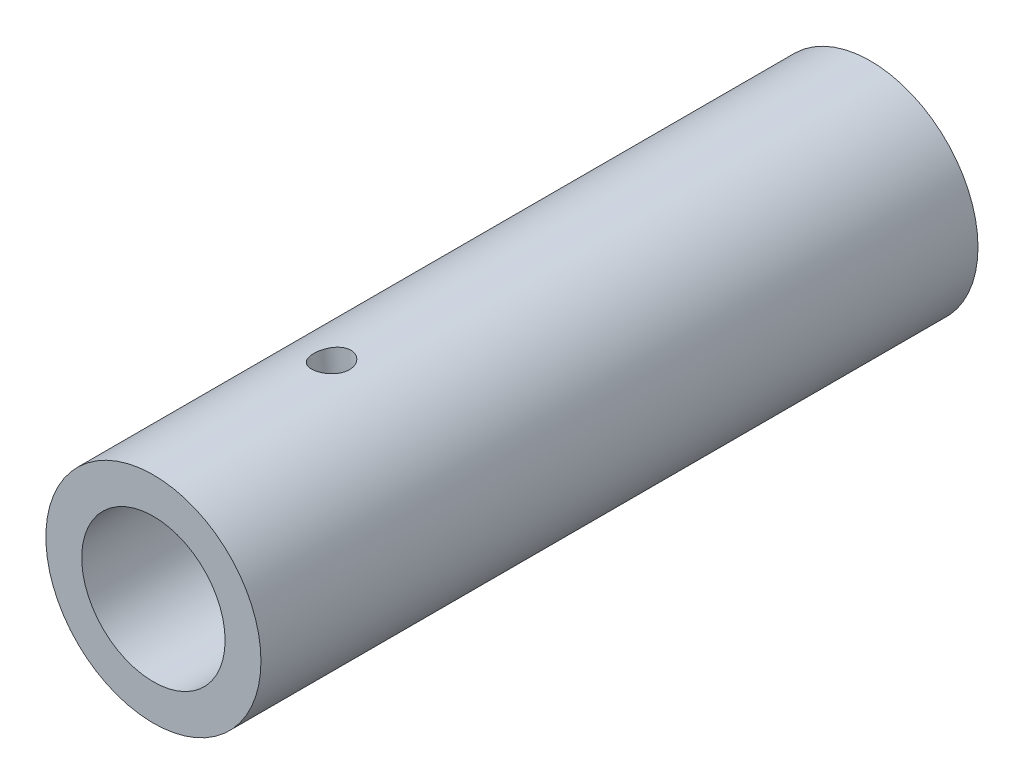
ISO-10303-21;
HEADER;
FILE_DESCRIPTION(('STEP AP214'),'2;1');
FILE_NAME('part.step','',(''),(''),'','','');
FILE_SCHEMA(('AUTOMOTIVE_DESIGN { 1 0 10303 214 1 1 1 1 }'));
ENDSEC;
DATA;
#1=APPLICATION_CONTEXT('core data for automotive mechanical design processes');
#2=APPLICATION_PROTOCOL_DEFINITION('international standard','automotive_design',2000,#1);
#3=PRODUCT_CONTEXT('',#1,'mechanical');
#4=PRODUCT('Part','Part','',(#3));
#5=PRODUCT_RELATED_PRODUCT_CATEGORY('part','',(#4));
#6=PRODUCT_DEFINITION_FORMATION('','',#4);
#7=PRODUCT_DEFINITION_CONTEXT('part definition',#1,'design');
#8=PRODUCT_DEFINITION('design','',#6,#7);
#9=PRODUCT_DEFINITION_SHAPE('','',#8);
#10=(LENGTH_UNIT() NAMED_UNIT(*) SI_UNIT(.MILLI.,.METRE.));
#11=(NAMED_UNIT(*) PLANE_ANGLE_UNIT() SI_UNIT($,.RADIAN.));
#12=(NAMED_UNIT(*) SI_UNIT($,.STERADIAN.) SOLID_ANGLE_UNIT());
#13=UNCERTAINTY_MEASURE_WITH_UNIT(LENGTH_MEASURE(1.E-05),#10,'distance_accuracy_value','');
#14=(GEOMETRIC_REPRESENTATION_CONTEXT(3) GLOBAL_UNCERTAINTY_ASSIGNED_CONTEXT((#13)) GLOBAL_UNIT_ASSIGNED_CONTEXT((#10,
#11,#12)) REPRESENTATION_CONTEXT('',''));
#15=CARTESIAN_POINT('',(0.,0.,0.));
#16=DIRECTION('',(0.,0.,1.));
#17=DIRECTION('',(1.,0.,0.));
#18=AXIS2_PLACEMENT_3D('',#15,#16,#17);
#19=CARTESIAN_POINT('',(0.,0.,63.5));
#20=DIRECTION('',(0.,0.,-1.));
#21=DIRECTION('',(-1.,0.,0.));
#22=AXIS2_PLACEMENT_3D('',#19,#20,#21);
#23=CYLINDRICAL_SURFACE('',#22,9.525);
#24=CARTESIAN_POINT('',(-2.55989168892291,9.17456154489049,46.736));
#25=CARTESIAN_POINT('',(-2.55988831826612,9.17456350531099,46.647496399918));
#26=CARTESIAN_POINT('',(-2.5526382001706,9.17659495945552,46.5589444701448));
#27=CARTESIAN_POINT('',(-2.52383087530217,9.18455864563898,46.3843252250277));
#28=CARTESIAN_POINT('',(-2.50226047444081,9.19049447495359,46.2982602774636));
#29=CARTESIAN_POINT('',(-2.4454507172223,9.20577291746254,46.1311674000781));
#30=CARTESIAN_POINT('',(-2.41022278459267,9.21511268307277,46.0501353260995));
#31=CARTESIAN_POINT('',(-2.32707723750839,9.23645875416685,45.8952720937542));
#32=CARTESIAN_POINT('',(-2.27916105107415,9.24846475954985,45.8214401263184));
#33=CARTESIAN_POINT('',(-2.17143462089355,9.27435085387942,45.6823363404122));
#34=CARTESIAN_POINT('',(-2.11152317045665,9.28824654257293,45.6171457915698));
#35=CARTESIAN_POINT('',(-1.98165553828989,9.31681696341755,45.4978812501428));
#36=CARTESIAN_POINT('',(-1.91169876163923,9.33149174167671,45.4438079164217));
#37=CARTESIAN_POINT('',(-1.76314392658459,9.36069997875275,45.3480077498158));
#38=CARTESIAN_POINT('',(-1.68449677465692,9.37523207093537,45.3063565500903));
#39=CARTESIAN_POINT('',(-1.52106101932333,9.40313045704525,45.2370691202131));
#40=CARTESIAN_POINT('',(-1.43627281565095,9.41649682672716,45.2094319787931));
#41=CARTESIAN_POINT('',(-1.26375408459807,9.44119007950734,45.1692057402852));
#42=CARTESIAN_POINT('',(-1.17605794004749,9.45253464907446,45.156480098337));
#43=CARTESIAN_POINT('',(-0.999505048796109,9.47282996252522,45.1460134961131));
#44=CARTESIAN_POINT('',(-0.910648381392007,9.48178086907586,45.148271517318));
#45=CARTESIAN_POINT('',(-0.735230344673378,9.49698579016896,45.1676016582204));
#46=CARTESIAN_POINT('',(-0.648654958289234,9.50326563824046,45.1845268287648));
#47=CARTESIAN_POINT('',(-0.479351267696876,9.51330876293258,45.2324794321465));
#48=CARTESIAN_POINT('',(-0.396623080741902,9.51707196289863,45.2635072944893));
#49=CARTESIAN_POINT('',(-0.236966179823889,9.52238876595142,45.3389305566002));
#50=CARTESIAN_POINT('',(-0.160065752179453,9.52393217377622,45.3833865076724));
#51=CARTESIAN_POINT('',(-0.0146199080776866,9.525266888753,45.4843596423733));
#52=CARTESIAN_POINT('',(0.0539248314585257,9.52505805404577,45.5408778021814));
#53=CARTESIAN_POINT('',(0.181524293810001,9.52348689043198,45.6651860422033));
#54=CARTESIAN_POINT('',(0.240453794329464,9.52211059800672,45.7331045552621));
#55=CARTESIAN_POINT('',(0.346092659652763,9.51885742525867,45.8778528022871));
#56=CARTESIAN_POINT('',(0.392801911734198,9.51698054031861,45.9546826184436));
#57=CARTESIAN_POINT('',(0.472639281531789,9.51335081678229,46.1152186925922));
#58=CARTESIAN_POINT('',(0.505752128836804,9.51159811948119,46.1989325562885));
#59=CARTESIAN_POINT('',(0.557269839074049,9.50871955166309,46.3707791609153));
#60=CARTESIAN_POINT('',(0.575675997053133,9.50759362595628,46.4589115120346));
#61=CARTESIAN_POINT('',(0.597050587726222,9.50627532108073,46.635966009163));
#62=CARTESIAN_POINT('',(0.600200771748791,9.50607195292405,46.7248661511108));
#63=CARTESIAN_POINT('',(0.591453617683163,9.50662011939308,46.9019170365237));
#64=CARTESIAN_POINT('',(0.579556860797966,9.50737161713614,46.9900678088014));
#65=CARTESIAN_POINT('',(0.54122623612501,9.50962986394587,47.1625471270862));
#66=CARTESIAN_POINT('',(0.514884800587795,9.51113180551065,47.2468963238225));
#67=CARTESIAN_POINT('',(0.44854656252462,9.5144903923999,47.4100335555875));
#68=CARTESIAN_POINT('',(0.408548943104592,9.51634705894061,47.4888212575948));
#69=CARTESIAN_POINT('',(0.315657924266237,9.51988220125152,47.6393983674479));
#70=CARTESIAN_POINT('',(0.26264898315702,9.52155887552392,47.7111165237001));
#71=CARTESIAN_POINT('',(0.145463741301043,9.52406907439896,47.8447820932613));
#72=CARTESIAN_POINT('',(0.0812866550913914,9.52490253967006,47.9067288187547));
#73=CARTESIAN_POINT('',(-0.0571480730046795,9.5250821755016,48.0197489518827));
#74=CARTESIAN_POINT('',(-0.131503609236493,9.52441278840041,48.0707025796907));
#75=CARTESIAN_POINT('',(-0.287649892620324,9.52097537632037,48.1594511326481));
#76=CARTESIAN_POINT('',(-0.369440399158309,9.51820741923516,48.1972464834409));
#77=CARTESIAN_POINT('',(-0.537727623201132,9.51018048859539,48.2584192208113));
#78=CARTESIAN_POINT('',(-0.624202060168446,9.50493252434683,48.2818592880917));
#79=CARTESIAN_POINT('',(-0.799663983000664,9.49178049376597,48.313857905342));
#80=CARTESIAN_POINT('',(-0.888651261474124,9.48387664604729,48.322417679795));
#81=CARTESIAN_POINT('',(-1.06545013855092,9.46563492669853,48.3243774952682));
#82=CARTESIAN_POINT('',(-1.15326292964579,9.45532767632539,48.3179597862526));
#83=CARTESIAN_POINT('',(-1.32629905109098,9.43261218973686,48.2905410093589));
#84=CARTESIAN_POINT('',(-1.41152239593837,9.42020396528637,48.2695400231414));
#85=CARTESIAN_POINT('',(-1.57692125298234,9.39393179886248,48.2136207648797));
#86=CARTESIAN_POINT('',(-1.65710227067637,9.38006949028499,48.1787179881864));
#87=CARTESIAN_POINT('',(-1.81037746945977,9.35169722444922,48.0960062104938));
#88=CARTESIAN_POINT('',(-1.88347131438051,9.33718723651694,48.0481965976863));
#89=CARTESIAN_POINT('',(-2.02145862745322,9.30829540594342,47.9403822162866));
#90=CARTESIAN_POINT('',(-2.08624854075988,9.29391693648733,47.8802439937294));
#91=CARTESIAN_POINT('',(-2.20494327555553,9.26647564558147,47.7497595244847));
#92=CARTESIAN_POINT('',(-2.25884554391002,9.25341313308052,47.6794108901039));
#93=CARTESIAN_POINT('',(-2.354649544386,9.22950231060974,47.5299117202076));
#94=CARTESIAN_POINT('',(-2.39646369359372,9.21867031640528,47.4507024442027));
#95=CARTESIAN_POINT('',(-2.46637448626326,9.20021414699752,47.2861581351963));
#96=CARTESIAN_POINT('',(-2.49448483346111,9.19258676825342,47.2008293200878));
#97=CARTESIAN_POINT('',(-2.53012874624201,9.18282631080359,47.051973606382));
#98=CARTESIAN_POINT('',(-2.54127273363322,9.17973953675243,46.9893479769455));
#99=CARTESIAN_POINT('',(-2.55615534868146,9.17560646802606,46.8631565371268));
#100=CARTESIAN_POINT('',(-2.55989411077437,9.17456013630827,46.7995907438336));
#101=CARTESIAN_POINT('',(-2.55989168892291,9.17456154489049,46.736));
#102=B_SPLINE_CURVE_WITH_KNOTS('',3,(#24,#25,#26,#27,#28,#29,#30,#31,#32,#33,#34,#35,#36,#37,
#38,#39,#40,#41,#42,#43,#44,#45,#46,#47,#48,#49,#50,#51,#52,#53,#54,#55,#56,#57,#58,#59,#60,#61,
#62,#63,#64,#65,#66,#67,#68,#69,#70,#71,#72,#73,#74,#75,#76,#77,#78,#79,#80,#81,#82,#83,#84,#85,
#86,#87,#88,#89,#90,#91,#92,#93,#94,#95,#96,#97,#98,#99,#100,#101),.UNSPECIFIED.,.T.,.F.,(4,2,2,
2,2,2,2,2,2,2,2,2,2,2,2,2,2,2,2,2,2,2,2,2,2,2,2,2,2,2,2,2,2,2,2,2,2,2,4),(0.,0.265278259719115,
0.530801275176486,0.796102673650747,1.06137422602349,1.32898616063879,1.59661395074875,
1.86583942370762,2.13504738795557,2.40177045345079,2.66847538854459,2.93253871939565,
3.19661009298453,3.46189048628536,3.72719235653995,3.99571288398449,4.26423588823722,
4.53305965686614,4.8018597507068,5.06744949436961,5.33302897967875,5.59692851043536,
5.86084383006419,6.12719337654315,6.39356166313488,6.66270011777467,6.93182986552703,
7.19977595105205,7.46769998654342,7.73238087928857,7.99706028993953,8.2614455029361,
8.52584325049132,8.79327043389165,9.0607602558995,9.33014217036923,9.59925414881156,
9.78986275793719,9.98046790668582),.UNSPECIFIED.);
#103=CARTESIAN_POINT('',(-2.55989168892291,9.17456154489049,46.736));
#104=VERTEX_POINT('',#103);
#105=EDGE_CURVE('E76',#104,#104,#102,.T.);
#106=ORIENTED_EDGE('',*,*,#105,.T.);
#107=EDGE_LOOP('',(#106));
#108=FACE_BOUND('',#107,.T.);
#109=CARTESIAN_POINT('',(0.,0.,63.5));
#110=DIRECTION('',(0.,0.,1.));
#111=DIRECTION('',(1.,0.,0.));
#112=AXIS2_PLACEMENT_3D('',#109,#110,#111);
#113=CIRCLE('',#112,9.525);
#114=CARTESIAN_POINT('',(9.525,0.,63.5));
#115=VERTEX_POINT('',#114);
#116=EDGE_CURVE('E64',#115,#115,#113,.T.);
#117=ORIENTED_EDGE('',*,*,#116,.F.);
#118=EDGE_LOOP('',(#117));
#119=FACE_BOUND('',#118,.T.);
#120=CARTESIAN_POINT('',(0.,0.,0.));
#121=DIRECTION('',(0.,0.,1.));
#122=DIRECTION('',(1.,0.,0.));
#123=AXIS2_PLACEMENT_3D('',#120,#121,#122);
#124=CIRCLE('',#123,9.525);
#125=CARTESIAN_POINT('',(9.525,0.,0.));
#126=VERTEX_POINT('',#125);
#127=EDGE_CURVE('E95',#126,#126,#124,.T.);
#128=ORIENTED_EDGE('',*,*,#127,.T.);
#129=EDGE_LOOP('',(#128));
#130=FACE_BOUND('',#129,.T.);
#131=ADVANCED_FACE('F42',(#108,#119,#130),#23,.T.);
#132=CARTESIAN_POINT('',(0.,0.,63.5));
#133=DIRECTION('',(0.,0.,1.));
#134=DIRECTION('',(1.,0.,0.));
#135=AXIS2_PLACEMENT_3D('',#132,#133,#134);
#136=PLANE('',#135);
#137=CARTESIAN_POINT('',(0.,0.,63.5));
#138=DIRECTION('',(0.,0.,1.));
#139=DIRECTION('',(1.,0.,0.));
#140=AXIS2_PLACEMENT_3D('',#137,#138,#139);
#141=CIRCLE('',#140,6.35);
#142=CARTESIAN_POINT('',(6.35,0.,63.5));
#143=VERTEX_POINT('',#142);
#144=EDGE_CURVE('E89',#143,#143,#141,.T.);
#145=ORIENTED_EDGE('',*,*,#144,.F.);
#146=EDGE_LOOP('',(#145));
#147=FACE_BOUND('',#146,.T.);
#148=ORIENTED_EDGE('',*,*,#116,.T.);
#149=EDGE_LOOP('',(#148));
#150=FACE_BOUND('',#149,.T.);
#151=ADVANCED_FACE('F112',(#147,#150),#136,.T.);
#152=CARTESIAN_POINT('',(0.,0.,0.));
#153=DIRECTION('',(0.,0.,1.));
#154=DIRECTION('',(1.,0.,0.));
#155=AXIS2_PLACEMENT_3D('',#152,#153,#154);
#156=PLANE('',#155);
#157=CARTESIAN_POINT('',(0.,0.,0.));
#158=DIRECTION('',(0.,0.,-1.));
#159=DIRECTION('',(-1.,0.,0.));
#160=AXIS2_PLACEMENT_3D('',#157,#158,#159);
#161=CIRCLE('',#160,6.3239396);
#162=CARTESIAN_POINT('',(-6.3239396,0.,0.));
#163=VERTEX_POINT('',#162);
#164=EDGE_CURVE('E225',#163,#163,#161,.T.);
#165=ORIENTED_EDGE('',*,*,#164,.F.);
#166=EDGE_LOOP('',(#165));
#167=FACE_BOUND('',#166,.T.);
#168=ORIENTED_EDGE('',*,*,#127,.F.);
#169=EDGE_LOOP('',(#168));
#170=FACE_BOUND('',#169,.T.);
#171=ADVANCED_FACE('F81',(#167,#170),#156,.F.);
#172=CARTESIAN_POINT('',(0.,0.,15.24));
#173=DIRECTION('',(0.,0.,1.));
#174=DIRECTION('',(1.,0.,0.));
#175=AXIS2_PLACEMENT_3D('',#172,#173,#174);
#176=CYLINDRICAL_SURFACE('',#175,6.35);
#177=CARTESIAN_POINT('',(-1.5352552919074,6.16161433300319,45.5424698259082));
#178=CARTESIAN_POINT('',(-1.59537678810267,6.14663470540504,45.6057186618809));
#179=CARTESIAN_POINT('',(-1.64982823468634,6.1321359909974,45.6745044845966));
#180=CARTESIAN_POINT('',(-1.74685628927597,6.10520580641474,45.8203721208462));
#181=CARTESIAN_POINT('',(-1.7894186742125,6.09277681940119,45.8974637192971));
#182=CARTESIAN_POINT('',(-1.86279924056462,6.07074670572261,46.0585066748159));
#183=CARTESIAN_POINT('',(-1.89347531356184,6.06118009102036,46.1425272907608));
#184=CARTESIAN_POINT('',(-1.94218465890743,6.04574819735847,46.3144394818225));
#185=CARTESIAN_POINT('',(-1.96022007418172,6.03988229104771,46.4023303981347));
#186=CARTESIAN_POINT('',(-1.98468147847544,6.03189285044413,46.588680943611));
#187=CARTESIAN_POINT('',(-1.98979838696114,6.03019180543395,46.6873330167476));
#188=CARTESIAN_POINT('',(-1.98460579258066,6.03190218549738,46.8842105667289));
#189=CARTESIAN_POINT('',(-1.97429089242113,6.03531539928972,46.9824358822628));
#190=CARTESIAN_POINT('',(-1.93792827663573,6.04709087519716,47.1778507580266));
#191=CARTESIAN_POINT('',(-1.91154555796614,6.05555844012512,47.2749721225143));
#192=CARTESIAN_POINT('',(-1.84294538607433,6.07678666545319,47.4630527332371));
#193=CARTESIAN_POINT('',(-1.80072004354115,6.08954946446755,47.5540088826297));
#194=CARTESIAN_POINT('',(-1.70224349645687,6.11779459266944,47.7238952281841));
#195=CARTESIAN_POINT('',(-1.6464464618536,6.13318481914204,47.8031025059197));
#196=CARTESIAN_POINT('',(-1.52078518910066,6.16554047225022,47.949026897868));
#197=CARTESIAN_POINT('',(-1.45094993983432,6.18250261460193,48.015769213097));
#198=CARTESIAN_POINT('',(-1.32042134643235,6.21144770068859,48.1158448844627));
#199=CARTESIAN_POINT('',(-1.26285571581384,6.22346264568183,48.1532692438344));
#200=CARTESIAN_POINT('',(-1.14214497939012,6.24674070775008,48.218014665701));
#201=CARTESIAN_POINT('',(-1.07900448987476,6.25800443355649,48.2453439920061));
#202=CARTESIAN_POINT('',(-0.94823272921376,6.2791527126661,48.2884721131978));
#203=CARTESIAN_POINT('',(-0.880578027823099,6.28902908497854,48.3042046594862));
#204=CARTESIAN_POINT('',(-0.743255666710866,6.30673068347335,48.3227760535236));
#205=CARTESIAN_POINT('',(-0.673588850286035,6.31455675549455,48.3256202262092));
#206=CARTESIAN_POINT('',(-0.541417241115669,6.3271916341513,48.3185801826672));
#207=CARTESIAN_POINT('',(-0.478865729857623,6.33221767641478,48.3098892952861));
#208=CARTESIAN_POINT('',(-0.355926396674106,6.3403164863451,48.2823477412909));
#209=CARTESIAN_POINT('',(-0.295538683395975,6.34338915605967,48.2634965652747));
#210=CARTESIAN_POINT('',(-0.177705471363907,6.3477904816165,48.2163598337415));
#211=CARTESIAN_POINT('',(-0.120303045842187,6.34909815242251,48.1879656870823));
#212=CARTESIAN_POINT('',(-0.0102843926260279,6.35023044893899,48.1230745053097));
#213=CARTESIAN_POINT('',(0.042330129226494,6.35005454815505,48.0865745980737));
#214=CARTESIAN_POINT('',(0.148349198486213,6.3485155118516,48.0017216928625));
#215=CARTESIAN_POINT('',(0.201018232706682,6.34700560043329,47.9524547316068));
#216=CARTESIAN_POINT('',(0.298783401662214,6.34315587730504,47.8469488089486));
#217=CARTESIAN_POINT('',(0.343875109281256,6.34081558290408,47.7907058048559));
#218=CARTESIAN_POINT('',(0.432914189071411,6.33540807999038,47.662941576964));
#219=CARTESIAN_POINT('',(0.475441116078664,6.3322846566537,47.5904314865235));
#220=CARTESIAN_POINT('',(0.54932613144058,6.32630341979474,47.4399215806326));
#221=CARTESIAN_POINT('',(0.580678240760582,6.32344574906466,47.3619188530193));
#222=CARTESIAN_POINT('',(0.635237571901405,6.31821403872319,47.1919013917344));
#223=CARTESIAN_POINT('',(0.656874677137149,6.31594976872846,47.0993762863181));
#224=CARTESIAN_POINT('',(0.685284209903709,6.31293021041372,46.9120480753042));
#225=CARTESIAN_POINT('',(0.692052758521446,6.31217531586458,46.8172443817875));
#226=CARTESIAN_POINT('',(0.690590365919125,6.31233650392791,46.6224716240054));
#227=CARTESIAN_POINT('',(0.681506476372678,6.31334760957265,46.5225077741895));
#228=CARTESIAN_POINT('',(0.646786282361563,6.31699832167453,46.3254700002368));
#229=CARTESIAN_POINT('',(0.621142003265598,6.31963871268438,46.2283974919934));
#230=CARTESIAN_POINT('',(0.55361459412434,6.32591176703145,46.0400105973382));
#231=CARTESIAN_POINT('',(0.511720763759187,6.32954508374292,45.9487000513374));
#232=CARTESIAN_POINT('',(0.412205621520949,6.33680245833395,45.7750964903406));
#233=CARTESIAN_POINT('',(0.354601429540802,6.34042652198266,45.6927937953279));
#234=CARTESIAN_POINT('',(0.239097157413685,6.34569739723935,45.5578855403134));
#235=CARTESIAN_POINT('',(0.184148904237818,6.34760520710226,45.5027561250535));
#236=CARTESIAN_POINT('',(0.0659476362583228,6.34993202409512,45.4021556098517));
#237=CARTESIAN_POINT('',(0.00269867997514074,6.35035175600979,45.3566798181563));
#238=CARTESIAN_POINT('',(-0.131473229159888,6.34899536286267,45.2773502624704));
#239=CARTESIAN_POINT('',(-0.202454665136638,6.34720126685589,45.2435945014932));
#240=CARTESIAN_POINT('',(-0.349530169932077,6.34079750510119,45.1905997560825));
#241=CARTESIAN_POINT('',(-0.425617987119355,6.33619122823102,45.171343361165));
#242=CARTESIAN_POINT('',(-0.568843790223599,6.3248183505409,45.1505325424976));
#243=CARTESIAN_POINT('',(-0.635707878868244,6.31845427303715,45.146842604491));
#244=CARTESIAN_POINT('',(-0.768770235715974,6.3036470270611,45.1515239441863));
#245=CARTESIAN_POINT('',(-0.834968697279105,6.29520448166284,45.1598916109537));
#246=CARTESIAN_POINT('',(-0.960133159803067,6.27729040345062,45.18713898675));
#247=CARTESIAN_POINT('',(-1.01928388764149,6.26792906224287,45.2052588700377));
#248=CARTESIAN_POINT('',(-1.13383319961398,6.24822397332459,45.2504999199515));
#249=CARTESIAN_POINT('',(-1.18923160858499,6.23788017980601,45.2776215064405));
#250=CARTESIAN_POINT('',(-1.29639051400049,6.21650394967002,45.34031649878));
#251=CARTESIAN_POINT('',(-1.34805520004059,6.20546183608368,45.3760492136965));
#252=CARTESIAN_POINT('',(-1.44587745838249,6.18340172377811,45.4543878585655));
#253=CARTESIAN_POINT('',(-1.49203171610046,6.17238374344742,45.4969978894233));
#254=CARTESIAN_POINT('',(-1.5352552919074,6.16161433300319,45.5424698259082));
#255=B_SPLINE_CURVE_WITH_KNOTS('',3,(#177,#178,#179,#180,#181,#182,#183,#184,#185,#186,#187,
#188,#189,#190,#191,#192,#193,#194,#195,#196,#197,#198,#199,#200,#201,#202,#203,#204,#205,#206,
#207,#208,#209,#210,#211,#212,#213,#214,#215,#216,#217,#218,#219,#220,#221,#222,#223,#224,#225,
#226,#227,#228,#229,#230,#231,#232,#233,#234,#235,#236,#237,#238,#239,#240,#241,#242,#243,#244,
#245,#246,#247,#248,#249,#250,#251,#252,#253,#254),.UNSPECIFIED.,.T.,.F.,(4,2,2,2,2,2,2,2,2,2,2,
2,2,2,2,2,2,2,2,2,2,2,2,2,2,2,2,2,2,2,2,2,2,2,2,2,2,2,4),(0.,0.265378356863427,
0.531072843422367,0.799852484151974,1.06858654859298,1.36362362338279,1.65876391186554,
1.96027897476036,2.26194438586585,2.55464385225033,2.84674499172656,3.05502083921448,
3.26312581192892,3.47241059707707,3.6816089066235,3.87076512555581,4.0599308290163,
4.2513263794575,4.44278985579264,4.65837386422193,4.87408339473729,5.12543891316706,
5.37692871703734,5.66082499722,5.94479533154989,6.24451930932617,6.54438772648022,
6.84445394296516,7.14419446891278,7.37684825773349,7.60938871438909,7.84382931972554,
8.07798796360569,8.27870211134558,8.47935616298422,8.66625701914031,8.85316659406285,
9.04384282566917,9.23463317939146),.UNSPECIFIED.);
#256=CARTESIAN_POINT('',(-0.663329102541232,6.31525886260586,45.1485));
#257=VERTEX_POINT('',#256);
#258=CARTESIAN_POINT('',(-0.663329102541232,6.31525886260586,48.3235));
#259=VERTEX_POINT('',#258);
#260=EDGE_CURVE('E52',#257,#259,#255,.T.);
#261=ORIENTED_EDGE('',*,*,#260,.T.);
#262=EDGE_CURVE('E11',#259,#257,#255,.T.);
#263=ORIENTED_EDGE('',*,*,#262,.T.);
#264=EDGE_LOOP('',(#261,#263));
#265=FACE_BOUND('',#264,.T.);
#266=CARTESIAN_POINT('',(0.,0.,15.24));
#267=DIRECTION('',(0.,0.,1.));
#268=DIRECTION('',(1.,0.,0.));
#269=AXIS2_PLACEMENT_3D('',#266,#267,#268);
#270=CIRCLE('',#269,6.35);
#271=CARTESIAN_POINT('',(6.35,0.,15.24));
#272=VERTEX_POINT('',#271);
#273=EDGE_CURVE('E86',#272,#272,#270,.T.);
#274=ORIENTED_EDGE('',*,*,#273,.F.);
#275=EDGE_LOOP('',(#274));
#276=FACE_BOUND('',#275,.T.);
#277=ORIENTED_EDGE('',*,*,#144,.T.);
#278=EDGE_LOOP('',(#277));
#279=FACE_BOUND('',#278,.T.);
#280=ADVANCED_FACE('F77',(#265,#276,#279),#176,.F.);
#281=CARTESIAN_POINT('',(0.,0.,15.24));
#282=DIRECTION('',(0.,0.,1.));
#283=DIRECTION('',(1.,0.,0.));
#284=AXIS2_PLACEMENT_3D('',#281,#282,#283);
#285=PLANE('',#284);
#286=CARTESIAN_POINT('',(0.,0.,15.24));
#287=DIRECTION('',(0.,0.,1.));
#288=DIRECTION('',(1.,0.,0.));
#289=AXIS2_PLACEMENT_3D('',#286,#287,#288);
#290=CIRCLE('',#289,5.5626);
#291=CARTESIAN_POINT('',(5.5626,0.,15.24));
#292=VERTEX_POINT('',#291);
#293=EDGE_CURVE('E46',#292,#292,#290,.T.);
#294=ORIENTED_EDGE('',*,*,#293,.F.);
#295=EDGE_LOOP('',(#294));
#296=FACE_BOUND('',#295,.T.);
#297=ORIENTED_EDGE('',*,*,#273,.T.);
#298=EDGE_LOOP('',(#297));
#299=FACE_BOUND('',#298,.T.);
#300=ADVANCED_FACE('F80',(#296,#299),#285,.T.);
#301=CARTESIAN_POINT('',(-0.994993653811849,9.47288829390879,46.736));
#302=DIRECTION('',(-0.104461275990745,0.99452895474108,0.));
#303=DIRECTION('',(-0.99452895474108,-0.104461275990745,0.));
#304=AXIS2_PLACEMENT_3D('',#301,#302,#303);
#305=CYLINDRICAL_SURFACE('',#304,1.5875);
#306=CARTESIAN_POINT('',(-0.663329102541233,6.31525886260586,46.736));
#307=DIRECTION('',(-0.104461275990745,0.99452895474108,0.));
#308=DIRECTION('',(-0.99452895474108,-0.104461275990745,0.));
#309=AXIS2_PLACEMENT_3D('',#306,#307,#308);
#310=CIRCLE('',#309,1.5875);
#311=EDGE_CURVE('E69',#259,#257,#310,.T.);
#312=ORIENTED_EDGE('',*,*,#311,.F.);
#313=EDGE_CURVE('E58',#257,#259,#310,.T.);
#314=ORIENTED_EDGE('',*,*,#313,.F.);
#315=EDGE_LOOP('',(#312,#314));
#316=FACE_BOUND('',#315,.T.);
#317=ORIENTED_EDGE('',*,*,#105,.F.);
#318=EDGE_LOOP('',(#317));
#319=FACE_BOUND('',#318,.T.);
#320=ADVANCED_FACE('F67',(#316,#319),#305,.F.);
#321=CARTESIAN_POINT('',(-0.663329102541233,6.31525886260586,46.736));
#322=DIRECTION('',(-0.104461275990745,0.99452895474108,0.));
#323=DIRECTION('',(-0.99452895474108,-0.104461275990745,0.));
#324=AXIS2_PLACEMENT_3D('',#321,#322,#323);
#325=CONICAL_SURFACE('',#324,1.5875,1.02974425867665);
#326=ORIENTED_EDGE('',*,*,#311,.T.);
#327=ORIENTED_EDGE('',*,*,#262,.F.);
#328=EDGE_LOOP('',(#326,#327));
#329=FACE_BOUND('',#328,.T.);
#330=ADVANCED_FACE('F74',(#329),#325,.F.);
#331=ORIENTED_EDGE('',*,*,#313,.T.);
#332=ORIENTED_EDGE('',*,*,#260,.F.);
#333=EDGE_LOOP('',(#331,#332));
#334=FACE_BOUND('',#333,.T.);
#335=ADVANCED_FACE('F61',(#334),#325,.F.);
#336=CARTESIAN_POINT('',(0.,0.,0.));
#337=DIRECTION('',(0.,0.,-1.));
#338=DIRECTION('',(-1.,0.,0.));
#339=AXIS2_PLACEMENT_3D('',#336,#337,#338);
#340=CYLINDRICAL_SURFACE('',#339,5.5626);
#341=ORIENTED_EDGE('',*,*,#293,.T.);
#342=EDGE_LOOP('',(#341));
#343=FACE_BOUND('',#342,.T.);
#344=CARTESIAN_POINT('',(0.,0.,12.7));
#345=DIRECTION('',(0.,0.,-1.));
#346=DIRECTION('',(-1.,0.,0.));
#347=AXIS2_PLACEMENT_3D('',#344,#345,#346);
#348=CIRCLE('',#347,5.5626);
#349=CARTESIAN_POINT('',(-5.5626,0.,12.7));
#350=VERTEX_POINT('',#349);
#351=EDGE_CURVE('E229',#350,#350,#348,.T.);
#352=ORIENTED_EDGE('',*,*,#351,.T.);
#353=EDGE_LOOP('',(#352));
#354=FACE_BOUND('',#353,.T.);
#355=ADVANCED_FACE('F128',(#343,#354),#340,.F.);
#356=CARTESIAN_POINT('',(5.5626,0.,12.7));
#357=DIRECTION('',(0.,0.,1.));
#358=DIRECTION('',(1.,0.,0.));
#359=AXIS2_PLACEMENT_3D('',#356,#357,#358);
#360=PLANE('',#359);
#361=ORIENTED_EDGE('',*,*,#351,.F.);
#362=EDGE_LOOP('',(#361));
#363=FACE_BOUND('',#362,.T.);
#364=CARTESIAN_POINT('',(0.,0.,12.7));
#365=DIRECTION('',(0.,0.,-1.));
#366=DIRECTION('',(-1.,0.,0.));
#367=AXIS2_PLACEMENT_3D('',#364,#365,#366);
#368=CIRCLE('',#367,5.94368459253425);
#369=CARTESIAN_POINT('',(-5.94368459253425,0.,12.7));
#370=VERTEX_POINT('',#369);
#371=EDGE_CURVE('E222',#370,#370,#368,.T.);
#372=ORIENTED_EDGE('',*,*,#371,.T.);
#373=EDGE_LOOP('',(#372));
#374=FACE_BOUND('',#373,.T.);
#375=ADVANCED_FACE('F135',(#363,#374),#360,.F.);
#376=CARTESIAN_POINT('',(0.,0.,0.));
#377=DIRECTION('',(0.,0.,-1.));
#378=DIRECTION('',(-1.,0.,0.));
#379=AXIS2_PLACEMENT_3D('',#376,#377,#378);
#380=CONICAL_SURFACE('',#379,6.3239396,0.0299323966717028);
#381=ORIENTED_EDGE('',*,*,#371,.F.);
#382=EDGE_LOOP('',(#381));
#383=FACE_BOUND('',#382,.T.);
#384=ORIENTED_EDGE('',*,*,#164,.T.);
#385=EDGE_LOOP('',(#384));
#386=FACE_BOUND('',#385,.T.);
#387=ADVANCED_FACE('F200',(#383,#386),#380,.F.);
#388=CLOSED_SHELL('',(#131,#151,#171,#280,#300,#320,#330,#335,#355,#375,#387));
#389=MANIFOLD_SOLID_BREP('B2',#388);
#390=ADVANCED_BREP_SHAPE_REPRESENTATION('',(#18,#389),#14);
#391=SHAPE_DEFINITION_REPRESENTATION(#9,#390);
ENDSEC;
END-ISO-10303-21;
